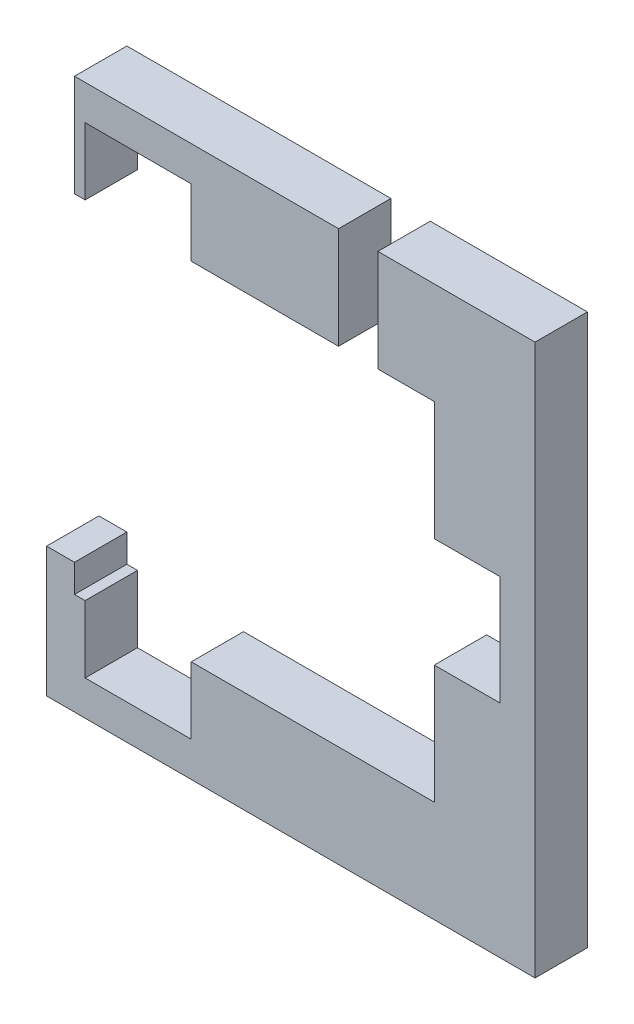
ISO-10303-21;
HEADER;
FILE_DESCRIPTION(('STEP AP214'),'2;1');
FILE_NAME('part.step','',(''),(''),'','','');
FILE_SCHEMA(('AUTOMOTIVE_DESIGN { 1 0 10303 214 1 1 1 1 }'));
ENDSEC;
DATA;
#1=APPLICATION_CONTEXT('core data for automotive mechanical design processes');
#2=APPLICATION_PROTOCOL_DEFINITION('international standard','automotive_design',2000,#1);
#3=PRODUCT_CONTEXT('',#1,'mechanical');
#4=PRODUCT('Part','Part','',(#3));
#5=PRODUCT_RELATED_PRODUCT_CATEGORY('part','',(#4));
#6=PRODUCT_DEFINITION_FORMATION('','',#4);
#7=PRODUCT_DEFINITION_CONTEXT('part definition',#1,'design');
#8=PRODUCT_DEFINITION('design','',#6,#7);
#9=PRODUCT_DEFINITION_SHAPE('','',#8);
#10=(LENGTH_UNIT() NAMED_UNIT(*) SI_UNIT(.MILLI.,.METRE.));
#11=(NAMED_UNIT(*) PLANE_ANGLE_UNIT() SI_UNIT($,.RADIAN.));
#12=(NAMED_UNIT(*) SI_UNIT($,.STERADIAN.) SOLID_ANGLE_UNIT());
#13=UNCERTAINTY_MEASURE_WITH_UNIT(LENGTH_MEASURE(1.E-05),#10,'distance_accuracy_value','');
#14=(GEOMETRIC_REPRESENTATION_CONTEXT(3) GLOBAL_UNCERTAINTY_ASSIGNED_CONTEXT((#13)) GLOBAL_UNIT_ASSIGNED_CONTEXT((#10,
#11,#12)) REPRESENTATION_CONTEXT('',''));
#15=CARTESIAN_POINT('',(0.,0.,0.));
#16=DIRECTION('',(0.,0.,1.));
#17=DIRECTION('',(1.,0.,0.));
#18=AXIS2_PLACEMENT_3D('',#15,#16,#17);
#19=CARTESIAN_POINT('',(7544.80021660651,3379.61343651415,4.7625));
#20=DIRECTION('',(0.,1.,0.));
#21=DIRECTION('',(0.,0.,1.));
#22=AXIS2_PLACEMENT_3D('',#19,#20,#21);
#23=PLANE('',#22);
#24=DIRECTION('',(1.,0.,0.));
#25=VECTOR('',#24,1.);
#26=CARTESIAN_POINT('',(7544.80021660651,3379.61343651415,0.));
#27=LINE('',#26,#25);
#28=CARTESIAN_POINT('',(7544.80021660651,3379.61343651415,0.));
#29=VERTEX_POINT('',#28);
#30=CARTESIAN_POINT('',(7589.25021660651,3379.61343651415,0.));
#31=VERTEX_POINT('',#30);
#32=EDGE_CURVE('E199',#29,#31,#27,.T.);
#33=ORIENTED_EDGE('',*,*,#32,.T.);
#34=DIRECTION('',(0.,0.,-1.));
#35=VECTOR('',#34,1.);
#36=CARTESIAN_POINT('',(7589.25021660651,3379.61343651415,4.7625));
#37=LINE('',#36,#35);
#38=CARTESIAN_POINT('',(7589.25021660651,3379.61343651415,4.7625));
#39=VERTEX_POINT('',#38);
#40=EDGE_CURVE('E12',#39,#31,#37,.T.);
#41=ORIENTED_EDGE('',*,*,#40,.F.);
#42=DIRECTION('',(1.,0.,0.));
#43=VECTOR('',#42,1.);
#44=CARTESIAN_POINT('',(7544.80021660651,3379.61343651415,4.7625));
#45=LINE('',#44,#43);
#46=CARTESIAN_POINT('',(7544.80021660651,3379.61343651415,4.7625));
#47=VERTEX_POINT('',#46);
#48=EDGE_CURVE('E233',#47,#39,#45,.T.);
#49=ORIENTED_EDGE('',*,*,#48,.F.);
#50=DIRECTION('',(0.,0.,-1.));
#51=VECTOR('',#50,1.);
#52=CARTESIAN_POINT('',(7544.80021660651,3379.61343651415,4.7625));
#53=LINE('',#52,#51);
#54=EDGE_CURVE('E195',#47,#29,#53,.T.);
#55=ORIENTED_EDGE('',*,*,#54,.T.);
#56=EDGE_LOOP('',(#33,#41,#49,#55));
#57=FACE_BOUND('',#56,.T.);
#58=ADVANCED_FACE('F43',(#57),#23,.F.);
#59=CARTESIAN_POINT('',(7589.25021660651,3429.72763651415,4.7625));
#60=DIRECTION('',(-1.,0.,0.));
#61=DIRECTION('',(0.,0.,1.));
#62=AXIS2_PLACEMENT_3D('',#59,#60,#61);
#63=PLANE('',#62);
#64=DIRECTION('',(0.,1.,0.));
#65=VECTOR('',#64,1.);
#66=CARTESIAN_POINT('',(7589.25021660651,3429.72763651415,0.));
#67=LINE('',#66,#65);
#68=CARTESIAN_POINT('',(7589.25021660651,3429.72763651415,0.));
#69=VERTEX_POINT('',#68);
#70=EDGE_CURVE('E202',#31,#69,#67,.T.);
#71=ORIENTED_EDGE('',*,*,#70,.T.);
#72=DIRECTION('',(0.,0.,-1.));
#73=VECTOR('',#72,1.);
#74=CARTESIAN_POINT('',(7589.25021660651,3429.72763651415,4.7625));
#75=LINE('',#74,#73);
#76=CARTESIAN_POINT('',(7589.25021660651,3429.72763651415,4.7625));
#77=VERTEX_POINT('',#76);
#78=EDGE_CURVE('E51',#77,#69,#75,.T.);
#79=ORIENTED_EDGE('',*,*,#78,.F.);
#80=DIRECTION('',(0.,1.,0.));
#81=VECTOR('',#80,1.);
#82=CARTESIAN_POINT('',(7589.25021660651,3429.72763651415,4.7625));
#83=LINE('',#82,#81);
#84=EDGE_CURVE('E132',#39,#77,#83,.T.);
#85=ORIENTED_EDGE('',*,*,#84,.F.);
#86=ORIENTED_EDGE('',*,*,#40,.T.);
#87=EDGE_LOOP('',(#71,#79,#85,#86));
#88=FACE_BOUND('',#87,.T.);
#89=ADVANCED_FACE('F341',(#88),#63,.F.);
#90=CARTESIAN_POINT('',(7574.95001660651,3429.72763651415,4.7625));
#91=DIRECTION('',(0.,-1.,0.));
#92=DIRECTION('',(1.,0.,0.));
#93=AXIS2_PLACEMENT_3D('',#90,#91,#92);
#94=PLANE('',#93);
#95=DIRECTION('',(-1.,0.,0.));
#96=VECTOR('',#95,1.);
#97=CARTESIAN_POINT('',(7574.95001660651,3429.72763651415,0.));
#98=LINE('',#97,#96);
#99=CARTESIAN_POINT('',(7574.95001660651,3429.72763651415,0.));
#100=VERTEX_POINT('',#99);
#101=EDGE_CURVE('E204',#69,#100,#98,.T.);
#102=ORIENTED_EDGE('',*,*,#101,.T.);
#103=DIRECTION('',(0.,0.,-1.));
#104=VECTOR('',#103,1.);
#105=CARTESIAN_POINT('',(7574.95001660651,3429.72763651415,4.7625));
#106=LINE('',#105,#104);
#107=CARTESIAN_POINT('',(7574.95001660651,3429.72763651415,4.7625));
#108=VERTEX_POINT('',#107);
#109=EDGE_CURVE('E270',#108,#100,#106,.T.);
#110=ORIENTED_EDGE('',*,*,#109,.F.);
#111=DIRECTION('',(-1.,0.,0.));
#112=VECTOR('',#111,1.);
#113=CARTESIAN_POINT('',(7574.95001660651,3429.72763651415,4.7625));
#114=LINE('',#113,#112);
#115=EDGE_CURVE('E278',#77,#108,#114,.T.);
#116=ORIENTED_EDGE('',*,*,#115,.F.);
#117=ORIENTED_EDGE('',*,*,#78,.T.);
#118=EDGE_LOOP('',(#102,#110,#116,#117));
#119=FACE_BOUND('',#118,.T.);
#120=ADVANCED_FACE('F276',(#119),#94,.F.);
#121=CARTESIAN_POINT('',(7574.95001660651,3429.72763651415,4.7625));
#122=DIRECTION('',(1.,-1.91603585309036E-13,0.));
#123=DIRECTION('',(1.91603585309036E-13,1.,0.));
#124=AXIS2_PLACEMENT_3D('',#121,#122,#123);
#125=PLANE('',#124);
#126=DIRECTION('',(-1.91603585309036E-13,-1.,0.));
#127=VECTOR('',#126,1.);
#128=CARTESIAN_POINT('',(7574.95001660651,3429.72763651415,0.));
#129=LINE('',#128,#127);
#130=CARTESIAN_POINT('',(7574.95001660651,3420.45663651415,0.));
#131=VERTEX_POINT('',#130);
#132=EDGE_CURVE('E206',#100,#131,#129,.T.);
#133=ORIENTED_EDGE('',*,*,#132,.T.);
#134=DIRECTION('',(0.,0.,-1.));
#135=VECTOR('',#134,1.);
#136=CARTESIAN_POINT('',(7574.95001660651,3420.45663651415,4.7625));
#137=LINE('',#136,#135);
#138=CARTESIAN_POINT('',(7574.95001660651,3420.45663651415,4.7625));
#139=VERTEX_POINT('',#138);
#140=EDGE_CURVE('E267',#139,#131,#137,.T.);
#141=ORIENTED_EDGE('',*,*,#140,.F.);
#142=DIRECTION('',(-1.91603585309036E-13,-1.,0.));
#143=VECTOR('',#142,1.);
#144=CARTESIAN_POINT('',(7574.95001660651,3429.72763651415,4.7625));
#145=LINE('',#144,#143);
#146=EDGE_CURVE('E296',#108,#139,#145,.T.);
#147=ORIENTED_EDGE('',*,*,#146,.F.);
#148=ORIENTED_EDGE('',*,*,#109,.T.);
#149=EDGE_LOOP('',(#133,#141,#147,#148));
#150=FACE_BOUND('',#149,.T.);
#151=ADVANCED_FACE('F287',(#150),#125,.F.);
#152=CARTESIAN_POINT('',(7574.95001660651,3420.45663651415,4.7625));
#153=DIRECTION('',(0.,1.,0.));
#154=DIRECTION('',(0.,0.,1.));
#155=AXIS2_PLACEMENT_3D('',#152,#153,#154);
#156=PLANE('',#155);
#157=DIRECTION('',(1.,0.,0.));
#158=VECTOR('',#157,1.);
#159=CARTESIAN_POINT('',(7574.95001660651,3420.45663651415,0.));
#160=LINE('',#159,#158);
#161=CARTESIAN_POINT('',(7580.08081660651,3420.45663651415,0.));
#162=VERTEX_POINT('',#161);
#163=EDGE_CURVE('E208',#131,#162,#160,.T.);
#164=ORIENTED_EDGE('',*,*,#163,.T.);
#165=DIRECTION('',(0.,0.,-1.));
#166=VECTOR('',#165,1.);
#167=CARTESIAN_POINT('',(7580.08081660651,3420.45663651415,4.7625));
#168=LINE('',#167,#166);
#169=CARTESIAN_POINT('',(7580.08081660651,3420.45663651415,4.7625));
#170=VERTEX_POINT('',#169);
#171=EDGE_CURVE('E264',#170,#162,#168,.T.);
#172=ORIENTED_EDGE('',*,*,#171,.F.);
#173=DIRECTION('',(1.,0.,0.));
#174=VECTOR('',#173,1.);
#175=CARTESIAN_POINT('',(7574.95001660651,3420.45663651415,4.7625));
#176=LINE('',#175,#174);
#177=EDGE_CURVE('E293',#139,#170,#176,.T.);
#178=ORIENTED_EDGE('',*,*,#177,.F.);
#179=ORIENTED_EDGE('',*,*,#140,.T.);
#180=EDGE_LOOP('',(#164,#172,#178,#179));
#181=FACE_BOUND('',#180,.T.);
#182=ADVANCED_FACE('F291',(#181),#156,.F.);
#183=CARTESIAN_POINT('',(7580.08081660651,3420.45663651415,4.7625));
#184=DIRECTION('',(1.,0.,0.));
#185=DIRECTION('',(0.,0.,-1.));
#186=AXIS2_PLACEMENT_3D('',#183,#184,#185);
#187=PLANE('',#186);
#188=DIRECTION('',(0.,-1.,0.));
#189=VECTOR('',#188,1.);
#190=CARTESIAN_POINT('',(7580.08081660651,3420.45663651415,0.));
#191=LINE('',#190,#189);
#192=CARTESIAN_POINT('',(7580.08081660651,3409.64893651415,0.));
#193=VERTEX_POINT('',#192);
#194=EDGE_CURVE('E210',#162,#193,#191,.T.);
#195=ORIENTED_EDGE('',*,*,#194,.T.);
#196=DIRECTION('',(0.,0.,-1.));
#197=VECTOR('',#196,1.);
#198=CARTESIAN_POINT('',(7580.08081660651,3409.64893651415,4.7625));
#199=LINE('',#198,#197);
#200=CARTESIAN_POINT('',(7580.08081660651,3409.64893651415,4.7625));
#201=VERTEX_POINT('',#200);
#202=EDGE_CURVE('E261',#201,#193,#199,.T.);
#203=ORIENTED_EDGE('',*,*,#202,.F.);
#204=DIRECTION('',(0.,-1.,0.));
#205=VECTOR('',#204,1.);
#206=CARTESIAN_POINT('',(7580.08081660651,3420.45663651415,4.7625));
#207=LINE('',#206,#205);
#208=EDGE_CURVE('E295',#170,#201,#207,.T.);
#209=ORIENTED_EDGE('',*,*,#208,.F.);
#210=ORIENTED_EDGE('',*,*,#171,.T.);
#211=EDGE_LOOP('',(#195,#203,#209,#210));
#212=FACE_BOUND('',#211,.T.);
#213=ADVANCED_FACE('F354',(#212),#187,.F.);
#214=CARTESIAN_POINT('',(7580.08081660651,3409.64893651415,4.7625));
#215=DIRECTION('',(0.,1.,0.));
#216=DIRECTION('',(0.,0.,1.));
#217=AXIS2_PLACEMENT_3D('',#214,#215,#216);
#218=PLANE('',#217);
#219=DIRECTION('',(1.,0.,0.));
#220=VECTOR('',#219,1.);
#221=CARTESIAN_POINT('',(7580.08081660651,3409.64893651415,0.));
#222=LINE('',#221,#220);
#223=CARTESIAN_POINT('',(7586.07521660651,3409.64893651415,0.));
#224=VERTEX_POINT('',#223);
#225=EDGE_CURVE('E212',#193,#224,#222,.T.);
#226=ORIENTED_EDGE('',*,*,#225,.T.);
#227=DIRECTION('',(0.,0.,-1.));
#228=VECTOR('',#227,1.);
#229=CARTESIAN_POINT('',(7586.07521660651,3409.64893651415,4.7625));
#230=LINE('',#229,#228);
#231=CARTESIAN_POINT('',(7586.07521660651,3409.64893651415,4.7625));
#232=VERTEX_POINT('',#231);
#233=EDGE_CURVE('E258',#232,#224,#230,.T.);
#234=ORIENTED_EDGE('',*,*,#233,.F.);
#235=DIRECTION('',(1.,0.,0.));
#236=VECTOR('',#235,1.);
#237=CARTESIAN_POINT('',(7580.08081660651,3409.64893651415,4.7625));
#238=LINE('',#237,#236);
#239=EDGE_CURVE('E298',#201,#232,#238,.T.);
#240=ORIENTED_EDGE('',*,*,#239,.F.);
#241=ORIENTED_EDGE('',*,*,#202,.T.);
#242=EDGE_LOOP('',(#226,#234,#240,#241));
#243=FACE_BOUND('',#242,.T.);
#244=ADVANCED_FACE('F357',(#243),#218,.F.);
#245=CARTESIAN_POINT('',(7586.07521660651,3409.64893651415,4.7625));
#246=DIRECTION('',(1.,0.,0.));
#247=DIRECTION('',(0.,0.,-1.));
#248=AXIS2_PLACEMENT_3D('',#245,#246,#247);
#249=PLANE('',#248);
#250=DIRECTION('',(0.,-1.,0.));
#251=VECTOR('',#250,1.);
#252=CARTESIAN_POINT('',(7586.07521660651,3409.64893651415,0.));
#253=LINE('',#252,#251);
#254=CARTESIAN_POINT('',(7586.07521660651,3399.69213651415,0.));
#255=VERTEX_POINT('',#254);
#256=EDGE_CURVE('E214',#224,#255,#253,.T.);
#257=ORIENTED_EDGE('',*,*,#256,.T.);
#258=DIRECTION('',(0.,0.,-1.));
#259=VECTOR('',#258,1.);
#260=CARTESIAN_POINT('',(7586.07521660651,3399.69213651415,4.7625));
#261=LINE('',#260,#259);
#262=CARTESIAN_POINT('',(7586.07521660651,3399.69213651415,4.7625));
#263=VERTEX_POINT('',#262);
#264=EDGE_CURVE('E255',#263,#255,#261,.T.);
#265=ORIENTED_EDGE('',*,*,#264,.F.);
#266=DIRECTION('',(0.,-1.,0.));
#267=VECTOR('',#266,1.);
#268=CARTESIAN_POINT('',(7586.07521660651,3409.64893651415,4.7625));
#269=LINE('',#268,#267);
#270=EDGE_CURVE('E304',#232,#263,#269,.T.);
#271=ORIENTED_EDGE('',*,*,#270,.F.);
#272=ORIENTED_EDGE('',*,*,#233,.T.);
#273=EDGE_LOOP('',(#257,#265,#271,#272));
#274=FACE_BOUND('',#273,.T.);
#275=ADVANCED_FACE('F361',(#274),#249,.F.);
#276=CARTESIAN_POINT('',(7580.08081660651,3399.69213651415,4.7625));
#277=DIRECTION('',(0.,-1.,0.));
#278=DIRECTION('',(0.,0.,-1.));
#279=AXIS2_PLACEMENT_3D('',#276,#277,#278);
#280=PLANE('',#279);
#281=DIRECTION('',(-1.,0.,0.));
#282=VECTOR('',#281,1.);
#283=CARTESIAN_POINT('',(7580.08081660651,3399.69213651415,0.));
#284=LINE('',#283,#282);
#285=CARTESIAN_POINT('',(7580.08081660651,3399.69213651415,0.));
#286=VERTEX_POINT('',#285);
#287=EDGE_CURVE('E216',#255,#286,#284,.T.);
#288=ORIENTED_EDGE('',*,*,#287,.T.);
#289=DIRECTION('',(0.,0.,-1.));
#290=VECTOR('',#289,1.);
#291=CARTESIAN_POINT('',(7580.08081660651,3399.69213651415,4.7625));
#292=LINE('',#291,#290);
#293=CARTESIAN_POINT('',(7580.08081660651,3399.69213651415,4.7625));
#294=VERTEX_POINT('',#293);
#295=EDGE_CURVE('E252',#294,#286,#292,.T.);
#296=ORIENTED_EDGE('',*,*,#295,.F.);
#297=DIRECTION('',(-1.,0.,0.));
#298=VECTOR('',#297,1.);
#299=CARTESIAN_POINT('',(7580.08081660651,3399.69213651415,4.7625));
#300=LINE('',#299,#298);
#301=EDGE_CURVE('E306',#263,#294,#300,.T.);
#302=ORIENTED_EDGE('',*,*,#301,.F.);
#303=ORIENTED_EDGE('',*,*,#264,.T.);
#304=EDGE_LOOP('',(#288,#296,#302,#303));
#305=FACE_BOUND('',#304,.T.);
#306=ADVANCED_FACE('F365',(#305),#280,.F.);
#307=CARTESIAN_POINT('',(7580.08081660651,3399.69213651415,4.7625));
#308=DIRECTION('',(1.,0.,0.));
#309=DIRECTION('',(0.,0.,-1.));
#310=AXIS2_PLACEMENT_3D('',#307,#308,#309);
#311=PLANE('',#310);
#312=DIRECTION('',(0.,-1.,0.));
#313=VECTOR('',#312,1.);
#314=CARTESIAN_POINT('',(7580.08081660651,3399.69213651415,0.));
#315=LINE('',#314,#313);
#316=CARTESIAN_POINT('',(7580.08081660651,3388.88443651415,0.));
#317=VERTEX_POINT('',#316);
#318=EDGE_CURVE('E218',#286,#317,#315,.T.);
#319=ORIENTED_EDGE('',*,*,#318,.T.);
#320=DIRECTION('',(0.,0.,-1.));
#321=VECTOR('',#320,1.);
#322=CARTESIAN_POINT('',(7580.08081660651,3388.88443651415,4.7625));
#323=LINE('',#322,#321);
#324=CARTESIAN_POINT('',(7580.08081660651,3388.88443651415,4.7625));
#325=VERTEX_POINT('',#324);
#326=EDGE_CURVE('E249',#325,#317,#323,.T.);
#327=ORIENTED_EDGE('',*,*,#326,.F.);
#328=DIRECTION('',(0.,-1.,0.));
#329=VECTOR('',#328,1.);
#330=CARTESIAN_POINT('',(7580.08081660651,3399.69213651415,4.7625));
#331=LINE('',#330,#329);
#332=EDGE_CURVE('E308',#294,#325,#331,.T.);
#333=ORIENTED_EDGE('',*,*,#332,.F.);
#334=ORIENTED_EDGE('',*,*,#295,.T.);
#335=EDGE_LOOP('',(#319,#327,#333,#334));
#336=FACE_BOUND('',#335,.T.);
#337=ADVANCED_FACE('F369',(#336),#311,.F.);
#338=CARTESIAN_POINT('',(7580.08081660651,3388.88443651415,4.7625));
#339=DIRECTION('',(0.,-1.,0.));
#340=DIRECTION('',(0.,0.,-1.));
#341=AXIS2_PLACEMENT_3D('',#338,#339,#340);
#342=PLANE('',#341);
#343=DIRECTION('',(-1.,0.,0.));
#344=VECTOR('',#343,1.);
#345=CARTESIAN_POINT('',(7580.08081660651,3388.88443651415,0.));
#346=LINE('',#345,#344);
#347=CARTESIAN_POINT('',(7557.95741660651,3388.88443651415,0.));
#348=VERTEX_POINT('',#347);
#349=EDGE_CURVE('E220',#317,#348,#346,.T.);
#350=ORIENTED_EDGE('',*,*,#349,.T.);
#351=DIRECTION('',(0.,0.,-1.));
#352=VECTOR('',#351,1.);
#353=CARTESIAN_POINT('',(7557.95741660651,3388.88443651415,4.7625));
#354=LINE('',#353,#352);
#355=CARTESIAN_POINT('',(7557.95741660651,3388.88443651415,4.7625));
#356=VERTEX_POINT('',#355);
#357=EDGE_CURVE('E246',#356,#348,#354,.T.);
#358=ORIENTED_EDGE('',*,*,#357,.F.);
#359=DIRECTION('',(-1.,0.,0.));
#360=VECTOR('',#359,1.);
#361=CARTESIAN_POINT('',(7580.08081660651,3388.88443651415,4.7625));
#362=LINE('',#361,#360);
#363=EDGE_CURVE('E310',#325,#356,#362,.T.);
#364=ORIENTED_EDGE('',*,*,#363,.F.);
#365=ORIENTED_EDGE('',*,*,#326,.T.);
#366=EDGE_LOOP('',(#350,#358,#364,#365));
#367=FACE_BOUND('',#366,.T.);
#368=ADVANCED_FACE('F373',(#367),#342,.F.);
#369=CARTESIAN_POINT('',(7557.95741660651,3388.88443651415,4.7625));
#370=DIRECTION('',(1.,2.91397119324194E-13,0.));
#371=DIRECTION('',(-2.91397119324194E-13,1.,0.));
#372=AXIS2_PLACEMENT_3D('',#369,#370,#371);
#373=PLANE('',#372);
#374=DIRECTION('',(2.91397119324194E-13,-1.,0.));
#375=VECTOR('',#374,1.);
#376=CARTESIAN_POINT('',(7557.95741660651,3388.88443651415,0.));
#377=LINE('',#376,#375);
#378=CARTESIAN_POINT('',(7557.95741660651,3382.78843651415,0.));
#379=VERTEX_POINT('',#378);
#380=EDGE_CURVE('E222',#348,#379,#377,.T.);
#381=ORIENTED_EDGE('',*,*,#380,.T.);
#382=DIRECTION('',(0.,0.,-1.));
#383=VECTOR('',#382,1.);
#384=CARTESIAN_POINT('',(7557.95741660651,3382.78843651415,4.7625));
#385=LINE('',#384,#383);
#386=CARTESIAN_POINT('',(7557.95741660651,3382.78843651415,4.7625));
#387=VERTEX_POINT('',#386);
#388=EDGE_CURVE('E243',#387,#379,#385,.T.);
#389=ORIENTED_EDGE('',*,*,#388,.F.);
#390=DIRECTION('',(2.91397119324194E-13,-1.,0.));
#391=VECTOR('',#390,1.);
#392=CARTESIAN_POINT('',(7557.95741660651,3388.88443651415,4.7625));
#393=LINE('',#392,#391);
#394=EDGE_CURVE('E312',#356,#387,#393,.T.);
#395=ORIENTED_EDGE('',*,*,#394,.F.);
#396=ORIENTED_EDGE('',*,*,#357,.T.);
#397=EDGE_LOOP('',(#381,#389,#395,#396));
#398=FACE_BOUND('',#397,.T.);
#399=ADVANCED_FACE('F377',(#398),#373,.F.);
#400=CARTESIAN_POINT('',(7548.30541660651,3382.78843651415,4.7625));
#401=DIRECTION('',(0.,-1.,0.));
#402=DIRECTION('',(0.,0.,-1.));
#403=AXIS2_PLACEMENT_3D('',#400,#401,#402);
#404=PLANE('',#403);
#405=DIRECTION('',(-1.,0.,0.));
#406=VECTOR('',#405,1.);
#407=CARTESIAN_POINT('',(7548.30541660651,3382.78843651415,0.));
#408=LINE('',#407,#406);
#409=CARTESIAN_POINT('',(7548.30541660651,3382.78843651415,0.));
#410=VERTEX_POINT('',#409);
#411=EDGE_CURVE('E224',#379,#410,#408,.T.);
#412=ORIENTED_EDGE('',*,*,#411,.T.);
#413=DIRECTION('',(0.,0.,-1.));
#414=VECTOR('',#413,1.);
#415=CARTESIAN_POINT('',(7548.30541660651,3382.78843651415,4.7625));
#416=LINE('',#415,#414);
#417=CARTESIAN_POINT('',(7548.30541660651,3382.78843651415,4.7625));
#418=VERTEX_POINT('',#417);
#419=EDGE_CURVE('E240',#418,#410,#416,.T.);
#420=ORIENTED_EDGE('',*,*,#419,.F.);
#421=DIRECTION('',(-1.,0.,0.));
#422=VECTOR('',#421,1.);
#423=CARTESIAN_POINT('',(7548.30541660651,3382.78843651415,4.7625));
#424=LINE('',#423,#422);
#425=EDGE_CURVE('E314',#387,#418,#424,.T.);
#426=ORIENTED_EDGE('',*,*,#425,.F.);
#427=ORIENTED_EDGE('',*,*,#388,.T.);
#428=EDGE_LOOP('',(#412,#420,#426,#427));
#429=FACE_BOUND('',#428,.T.);
#430=ADVANCED_FACE('F381',(#429),#404,.F.);
#431=CARTESIAN_POINT('',(7548.30541660651,3388.88443651415,4.7625));
#432=DIRECTION('',(-1.,0.,0.));
#433=DIRECTION('',(0.,0.,1.));
#434=AXIS2_PLACEMENT_3D('',#431,#432,#433);
#435=PLANE('',#434);
#436=DIRECTION('',(0.,1.,0.));
#437=VECTOR('',#436,1.);
#438=CARTESIAN_POINT('',(7548.30541660651,3388.88443651415,0.));
#439=LINE('',#438,#437);
#440=CARTESIAN_POINT('',(7548.30541660651,3388.88443651415,0.));
#441=VERTEX_POINT('',#440);
#442=EDGE_CURVE('E226',#410,#441,#439,.T.);
#443=ORIENTED_EDGE('',*,*,#442,.T.);
#444=DIRECTION('',(0.,0.,-1.));
#445=VECTOR('',#444,1.);
#446=CARTESIAN_POINT('',(7548.30541660651,3388.88443651415,4.7625));
#447=LINE('',#446,#445);
#448=CARTESIAN_POINT('',(7548.30541660651,3388.88443651415,4.7625));
#449=VERTEX_POINT('',#448);
#450=EDGE_CURVE('E237',#449,#441,#447,.T.);
#451=ORIENTED_EDGE('',*,*,#450,.F.);
#452=DIRECTION('',(0.,1.,0.));
#453=VECTOR('',#452,1.);
#454=CARTESIAN_POINT('',(7548.30541660651,3388.88443651415,4.7625));
#455=LINE('',#454,#453);
#456=EDGE_CURVE('E316',#418,#449,#455,.T.);
#457=ORIENTED_EDGE('',*,*,#456,.F.);
#458=ORIENTED_EDGE('',*,*,#419,.T.);
#459=EDGE_LOOP('',(#443,#451,#457,#458));
#460=FACE_BOUND('',#459,.T.);
#461=ADVANCED_FACE('F322',(#460),#435,.F.);
#462=CARTESIAN_POINT('',(7548.30541660651,3388.88443651415,4.7625));
#463=DIRECTION('',(0.,-1.,0.));
#464=DIRECTION('',(0.,0.,-1.));
#465=AXIS2_PLACEMENT_3D('',#462,#463,#464);
#466=PLANE('',#465);
#467=DIRECTION('',(-1.,0.,0.));
#468=VECTOR('',#467,1.);
#469=CARTESIAN_POINT('',(7548.30541660651,3388.88443651415,0.));
#470=LINE('',#469,#468);
#471=CARTESIAN_POINT('',(7547.34021660651,3388.88443651415,0.));
#472=VERTEX_POINT('',#471);
#473=EDGE_CURVE('E228',#441,#472,#470,.T.);
#474=ORIENTED_EDGE('',*,*,#473,.T.);
#475=DIRECTION('',(0.,0.,-1.));
#476=VECTOR('',#475,1.);
#477=CARTESIAN_POINT('',(7547.34021660651,3388.88443651415,4.7625));
#478=LINE('',#477,#476);
#479=CARTESIAN_POINT('',(7547.34021660651,3388.88443651415,4.7625));
#480=VERTEX_POINT('',#479);
#481=EDGE_CURVE('E190',#480,#472,#478,.T.);
#482=ORIENTED_EDGE('',*,*,#481,.F.);
#483=DIRECTION('',(-1.,0.,0.));
#484=VECTOR('',#483,1.);
#485=CARTESIAN_POINT('',(7548.30541660651,3388.88443651415,4.7625));
#486=LINE('',#485,#484);
#487=EDGE_CURVE('E181',#449,#480,#486,.T.);
#488=ORIENTED_EDGE('',*,*,#487,.F.);
#489=ORIENTED_EDGE('',*,*,#450,.T.);
#490=EDGE_LOOP('',(#474,#482,#488,#489));
#491=FACE_BOUND('',#490,.T.);
#492=ADVANCED_FACE('F326',(#491),#466,.F.);
#493=CARTESIAN_POINT('',(7547.34021660651,3391.42443651415,4.7625));
#494=DIRECTION('',(-1.,0.,0.));
#495=DIRECTION('',(0.,0.,1.));
#496=AXIS2_PLACEMENT_3D('',#493,#494,#495);
#497=PLANE('',#496);
#498=DIRECTION('',(0.,1.,0.));
#499=VECTOR('',#498,1.);
#500=CARTESIAN_POINT('',(7547.34021660651,3391.42443651415,0.));
#501=LINE('',#500,#499);
#502=CARTESIAN_POINT('',(7547.34021660651,3391.42443651415,0.));
#503=VERTEX_POINT('',#502);
#504=EDGE_CURVE('E189',#472,#503,#501,.T.);
#505=ORIENTED_EDGE('',*,*,#504,.T.);
#506=DIRECTION('',(0.,0.,-1.));
#507=VECTOR('',#506,1.);
#508=CARTESIAN_POINT('',(7547.34021660651,3391.42443651415,4.7625));
#509=LINE('',#508,#507);
#510=CARTESIAN_POINT('',(7547.34021660651,3391.42443651415,4.7625));
#511=VERTEX_POINT('',#510);
#512=EDGE_CURVE('E186',#511,#503,#509,.T.);
#513=ORIENTED_EDGE('',*,*,#512,.F.);
#514=DIRECTION('',(0.,1.,0.));
#515=VECTOR('',#514,1.);
#516=CARTESIAN_POINT('',(7547.34021660651,3391.42443651415,4.7625));
#517=LINE('',#516,#515);
#518=EDGE_CURVE('E175',#480,#511,#517,.T.);
#519=ORIENTED_EDGE('',*,*,#518,.F.);
#520=ORIENTED_EDGE('',*,*,#481,.T.);
#521=EDGE_LOOP('',(#505,#513,#519,#520));
#522=FACE_BOUND('',#521,.T.);
#523=ADVANCED_FACE('F187',(#522),#497,.F.);
#524=CARTESIAN_POINT('',(7547.34021660651,3391.42443651415,4.7625));
#525=DIRECTION('',(0.,-1.,0.));
#526=DIRECTION('',(0.,0.,-1.));
#527=AXIS2_PLACEMENT_3D('',#524,#525,#526);
#528=PLANE('',#527);
#529=DIRECTION('',(-1.,0.,0.));
#530=VECTOR('',#529,1.);
#531=CARTESIAN_POINT('',(7547.34021660651,3391.42443651415,0.));
#532=LINE('',#531,#530);
#533=CARTESIAN_POINT('',(7544.80021660651,3391.42443651415,0.));
#534=VERTEX_POINT('',#533);
#535=EDGE_CURVE('E118',#503,#534,#532,.T.);
#536=ORIENTED_EDGE('',*,*,#535,.T.);
#537=DIRECTION('',(0.,0.,-1.));
#538=VECTOR('',#537,1.);
#539=CARTESIAN_POINT('',(7544.80021660651,3391.42443651415,4.7625));
#540=LINE('',#539,#538);
#541=CARTESIAN_POINT('',(7544.80021660651,3391.42443651415,4.7625));
#542=VERTEX_POINT('',#541);
#543=EDGE_CURVE('E191',#542,#534,#540,.T.);
#544=ORIENTED_EDGE('',*,*,#543,.F.);
#545=DIRECTION('',(-1.,0.,0.));
#546=VECTOR('',#545,1.);
#547=CARTESIAN_POINT('',(7547.34021660651,3391.42443651415,4.7625));
#548=LINE('',#547,#546);
#549=EDGE_CURVE('E179',#511,#542,#548,.T.);
#550=ORIENTED_EDGE('',*,*,#549,.F.);
#551=ORIENTED_EDGE('',*,*,#512,.T.);
#552=EDGE_LOOP('',(#536,#544,#550,#551));
#553=FACE_BOUND('',#552,.T.);
#554=ADVANCED_FACE('F193',(#553),#528,.F.);
#555=CARTESIAN_POINT('',(7544.80021660651,3379.61343651415,4.7625));
#556=DIRECTION('',(1.,0.,0.));
#557=DIRECTION('',(0.,0.,-1.));
#558=AXIS2_PLACEMENT_3D('',#555,#556,#557);
#559=PLANE('',#558);
#560=DIRECTION('',(0.,-1.,0.));
#561=VECTOR('',#560,1.);
#562=CARTESIAN_POINT('',(7544.80021660651,3379.61343651415,0.));
#563=LINE('',#562,#561);
#564=EDGE_CURVE('E124',#534,#29,#563,.T.);
#565=ORIENTED_EDGE('',*,*,#564,.T.);
#566=ORIENTED_EDGE('',*,*,#54,.F.);
#567=DIRECTION('',(0.,-1.,0.));
#568=VECTOR('',#567,1.);
#569=CARTESIAN_POINT('',(7544.80021660651,3379.61343651415,4.7625));
#570=LINE('',#569,#568);
#571=EDGE_CURVE('E59',#542,#47,#570,.T.);
#572=ORIENTED_EDGE('',*,*,#571,.F.);
#573=ORIENTED_EDGE('',*,*,#543,.T.);
#574=EDGE_LOOP('',(#565,#566,#572,#573));
#575=FACE_BOUND('',#574,.T.);
#576=ADVANCED_FACE('F330',(#575),#559,.F.);
#577=CARTESIAN_POINT('',(0.,0.,4.7625));
#578=DIRECTION('',(0.,0.,-1.));
#579=DIRECTION('',(-1.,0.,0.));
#580=AXIS2_PLACEMENT_3D('',#577,#578,#579);
#581=PLANE('',#580);
#582=ORIENTED_EDGE('',*,*,#48,.T.);
#583=ORIENTED_EDGE('',*,*,#84,.T.);
#584=ORIENTED_EDGE('',*,*,#115,.T.);
#585=ORIENTED_EDGE('',*,*,#146,.T.);
#586=ORIENTED_EDGE('',*,*,#177,.T.);
#587=ORIENTED_EDGE('',*,*,#208,.T.);
#588=ORIENTED_EDGE('',*,*,#239,.T.);
#589=ORIENTED_EDGE('',*,*,#270,.T.);
#590=ORIENTED_EDGE('',*,*,#301,.T.);
#591=ORIENTED_EDGE('',*,*,#332,.T.);
#592=ORIENTED_EDGE('',*,*,#363,.T.);
#593=ORIENTED_EDGE('',*,*,#394,.T.);
#594=ORIENTED_EDGE('',*,*,#425,.T.);
#595=ORIENTED_EDGE('',*,*,#456,.T.);
#596=ORIENTED_EDGE('',*,*,#487,.T.);
#597=ORIENTED_EDGE('',*,*,#518,.T.);
#598=ORIENTED_EDGE('',*,*,#549,.T.);
#599=ORIENTED_EDGE('',*,*,#571,.T.);
#600=EDGE_LOOP('',(#582,#583,#584,#585,#586,#587,#588,#589,#590,#591,#592,#593,#594,#595,#596,
#597,#598,#599));
#601=FACE_BOUND('',#600,.T.);
#602=ADVANCED_FACE('F177',(#601),#581,.F.);
#603=CARTESIAN_POINT('',(0.,0.,0.));
#604=DIRECTION('',(0.,0.,-1.));
#605=DIRECTION('',(-1.,0.,0.));
#606=AXIS2_PLACEMENT_3D('',#603,#604,#605);
#607=PLANE('',#606);
#608=ORIENTED_EDGE('',*,*,#32,.F.);
#609=ORIENTED_EDGE('',*,*,#564,.F.);
#610=ORIENTED_EDGE('',*,*,#535,.F.);
#611=ORIENTED_EDGE('',*,*,#504,.F.);
#612=ORIENTED_EDGE('',*,*,#473,.F.);
#613=ORIENTED_EDGE('',*,*,#442,.F.);
#614=ORIENTED_EDGE('',*,*,#411,.F.);
#615=ORIENTED_EDGE('',*,*,#380,.F.);
#616=ORIENTED_EDGE('',*,*,#349,.F.);
#617=ORIENTED_EDGE('',*,*,#318,.F.);
#618=ORIENTED_EDGE('',*,*,#287,.F.);
#619=ORIENTED_EDGE('',*,*,#256,.F.);
#620=ORIENTED_EDGE('',*,*,#225,.F.);
#621=ORIENTED_EDGE('',*,*,#194,.F.);
#622=ORIENTED_EDGE('',*,*,#163,.F.);
#623=ORIENTED_EDGE('',*,*,#132,.F.);
#624=ORIENTED_EDGE('',*,*,#101,.F.);
#625=ORIENTED_EDGE('',*,*,#70,.F.);
#626=EDGE_LOOP('',(#608,#609,#610,#611,#612,#613,#614,#615,#616,#617,#618,#619,#620,#621,#622,
#623,#624,#625));
#627=FACE_BOUND('',#626,.T.);
#628=ADVANCED_FACE('F282',(#627),#607,.T.);
#629=CLOSED_SHELL('',(#58,#89,#120,#151,#182,#213,#244,#275,#306,#337,#368,#399,#430,#461,#492,
#523,#554,#576,#602,#628));
#630=MANIFOLD_SOLID_BREP('B2',#629);
#631=CARTESIAN_POINT('',(7547.34021660651,3420.45663651415,4.7625));
#632=DIRECTION('',(0.,1.,0.));
#633=DIRECTION('',(0.,0.,1.));
#634=AXIS2_PLACEMENT_3D('',#631,#632,#633);
#635=PLANE('',#634);
#636=DIRECTION('',(1.,0.,0.));
#637=VECTOR('',#636,1.);
#638=CARTESIAN_POINT('',(7547.34021660651,3420.45663651415,0.));
#639=LINE('',#638,#637);
#640=CARTESIAN_POINT('',(7547.34021660651,3420.45663651415,0.));
#641=VERTEX_POINT('',#640);
#642=CARTESIAN_POINT('',(7548.30541660651,3420.45663651415,0.));
#643=VERTEX_POINT('',#642);
#644=EDGE_CURVE('E627',#641,#643,#639,.T.);
#645=ORIENTED_EDGE('',*,*,#644,.T.);
#646=DIRECTION('',(0.,0.,-1.));
#647=VECTOR('',#646,1.);
#648=CARTESIAN_POINT('',(7548.30541660651,3420.45663651415,4.7625));
#649=LINE('',#648,#647);
#650=CARTESIAN_POINT('',(7548.30541660651,3420.45663651415,4.7625));
#651=VERTEX_POINT('',#650);
#652=EDGE_CURVE('E41',#651,#643,#649,.T.);
#653=ORIENTED_EDGE('',*,*,#652,.F.);
#654=DIRECTION('',(1.,0.,0.));
#655=VECTOR('',#654,1.);
#656=CARTESIAN_POINT('',(7547.34021660651,3420.45663651415,4.7625));
#657=LINE('',#656,#655);
#658=CARTESIAN_POINT('',(7547.34021660651,3420.45663651415,4.7625));
#659=VERTEX_POINT('',#658);
#660=EDGE_CURVE('E641',#659,#651,#657,.T.);
#661=ORIENTED_EDGE('',*,*,#660,.F.);
#662=DIRECTION('',(0.,0.,-1.));
#663=VECTOR('',#662,1.);
#664=CARTESIAN_POINT('',(7547.34021660651,3420.45663651415,4.7625));
#665=LINE('',#664,#663);
#666=EDGE_CURVE('E623',#659,#641,#665,.T.);
#667=ORIENTED_EDGE('',*,*,#666,.T.);
#668=EDGE_LOOP('',(#645,#653,#661,#667));
#669=FACE_BOUND('',#668,.T.);
#670=ADVANCED_FACE('F531',(#669),#635,.F.);
#671=CARTESIAN_POINT('',(7548.30541660651,3420.45663651415,4.7625));
#672=DIRECTION('',(-1.,0.,0.));
#673=DIRECTION('',(0.,0.,1.));
#674=AXIS2_PLACEMENT_3D('',#671,#672,#673);
#675=PLANE('',#674);
#676=DIRECTION('',(0.,1.,0.));
#677=VECTOR('',#676,1.);
#678=CARTESIAN_POINT('',(7548.30541660651,3420.45663651415,0.));
#679=LINE('',#678,#677);
#680=CARTESIAN_POINT('',(7548.30541660651,3426.55263651415,0.));
#681=VERTEX_POINT('',#680);
#682=EDGE_CURVE('E630',#643,#681,#679,.T.);
#683=ORIENTED_EDGE('',*,*,#682,.T.);
#684=DIRECTION('',(0.,0.,-1.));
#685=VECTOR('',#684,1.);
#686=CARTESIAN_POINT('',(7548.30541660651,3426.55263651415,4.7625));
#687=LINE('',#686,#685);
#688=CARTESIAN_POINT('',(7548.30541660651,3426.55263651415,4.7625));
#689=VERTEX_POINT('',#688);
#690=EDGE_CURVE('E539',#689,#681,#687,.T.);
#691=ORIENTED_EDGE('',*,*,#690,.F.);
#692=DIRECTION('',(0.,1.,0.));
#693=VECTOR('',#692,1.);
#694=CARTESIAN_POINT('',(7548.30541660651,3420.45663651415,4.7625));
#695=LINE('',#694,#693);
#696=EDGE_CURVE('E590',#651,#689,#695,.T.);
#697=ORIENTED_EDGE('',*,*,#696,.F.);
#698=ORIENTED_EDGE('',*,*,#652,.T.);
#699=EDGE_LOOP('',(#683,#691,#697,#698));
#700=FACE_BOUND('',#699,.T.);
#701=ADVANCED_FACE('F676',(#700),#675,.F.);
#702=CARTESIAN_POINT('',(7548.30541660651,3426.55263651415,4.7625));
#703=DIRECTION('',(0.,1.,0.));
#704=DIRECTION('',(0.,0.,1.));
#705=AXIS2_PLACEMENT_3D('',#702,#703,#704);
#706=PLANE('',#705);
#707=DIRECTION('',(1.,0.,0.));
#708=VECTOR('',#707,1.);
#709=CARTESIAN_POINT('',(7548.30541660651,3426.55263651415,0.));
#710=LINE('',#709,#708);
#711=CARTESIAN_POINT('',(7557.95741660651,3426.55263651415,0.));
#712=VERTEX_POINT('',#711);
#713=EDGE_CURVE('E632',#681,#712,#710,.T.);
#714=ORIENTED_EDGE('',*,*,#713,.T.);
#715=DIRECTION('',(0.,0.,-1.));
#716=VECTOR('',#715,1.);
#717=CARTESIAN_POINT('',(7557.95741660651,3426.55263651415,4.7625));
#718=LINE('',#717,#716);
#719=CARTESIAN_POINT('',(7557.95741660651,3426.55263651415,4.7625));
#720=VERTEX_POINT('',#719);
#721=EDGE_CURVE('E648',#720,#712,#718,.T.);
#722=ORIENTED_EDGE('',*,*,#721,.F.);
#723=DIRECTION('',(1.,0.,0.));
#724=VECTOR('',#723,1.);
#725=CARTESIAN_POINT('',(7548.30541660651,3426.55263651415,4.7625));
#726=LINE('',#725,#724);
#727=EDGE_CURVE('E656',#689,#720,#726,.T.);
#728=ORIENTED_EDGE('',*,*,#727,.F.);
#729=ORIENTED_EDGE('',*,*,#690,.T.);
#730=EDGE_LOOP('',(#714,#722,#728,#729));
#731=FACE_BOUND('',#730,.T.);
#732=ADVANCED_FACE('F654',(#731),#706,.F.);
#733=CARTESIAN_POINT('',(7557.95741660651,3420.45663651415,4.7625));
#734=DIRECTION('',(1.,0.,0.));
#735=DIRECTION('',(0.,0.,-1.));
#736=AXIS2_PLACEMENT_3D('',#733,#734,#735);
#737=PLANE('',#736);
#738=DIRECTION('',(0.,-1.,0.));
#739=VECTOR('',#738,1.);
#740=CARTESIAN_POINT('',(7557.95741660651,3420.45663651415,0.));
#741=LINE('',#740,#739);
#742=CARTESIAN_POINT('',(7557.95741660651,3420.45663651415,0.));
#743=VERTEX_POINT('',#742);
#744=EDGE_CURVE('E634',#712,#743,#741,.T.);
#745=ORIENTED_EDGE('',*,*,#744,.T.);
#746=DIRECTION('',(0.,0.,-1.));
#747=VECTOR('',#746,1.);
#748=CARTESIAN_POINT('',(7557.95741660651,3420.45663651415,4.7625));
#749=LINE('',#748,#747);
#750=CARTESIAN_POINT('',(7557.95741660651,3420.45663651415,4.7625));
#751=VERTEX_POINT('',#750);
#752=EDGE_CURVE('E645',#751,#743,#749,.T.);
#753=ORIENTED_EDGE('',*,*,#752,.F.);
#754=DIRECTION('',(0.,-1.,0.));
#755=VECTOR('',#754,1.);
#756=CARTESIAN_POINT('',(7557.95741660651,3420.45663651415,4.7625));
#757=LINE('',#756,#755);
#758=EDGE_CURVE('E668',#720,#751,#757,.T.);
#759=ORIENTED_EDGE('',*,*,#758,.F.);
#760=ORIENTED_EDGE('',*,*,#721,.T.);
#761=EDGE_LOOP('',(#745,#753,#759,#760));
#762=FACE_BOUND('',#761,.T.);
#763=ADVANCED_FACE('F664',(#762),#737,.F.);
#764=CARTESIAN_POINT('',(7557.95741660651,3420.45663651415,4.7625));
#765=DIRECTION('',(0.,1.,0.));
#766=DIRECTION('',(0.,0.,1.));
#767=AXIS2_PLACEMENT_3D('',#764,#765,#766);
#768=PLANE('',#767);
#769=DIRECTION('',(1.,0.,0.));
#770=VECTOR('',#769,1.);
#771=CARTESIAN_POINT('',(7557.95741660651,3420.45663651415,0.));
#772=LINE('',#771,#770);
#773=CARTESIAN_POINT('',(7571.36861660651,3420.45663651415,0.));
#774=VERTEX_POINT('',#773);
#775=EDGE_CURVE('E636',#743,#774,#772,.T.);
#776=ORIENTED_EDGE('',*,*,#775,.T.);
#777=DIRECTION('',(0.,0.,-1.));
#778=VECTOR('',#777,1.);
#779=CARTESIAN_POINT('',(7571.36861660651,3420.45663651415,4.7625));
#780=LINE('',#779,#778);
#781=CARTESIAN_POINT('',(7571.36861660651,3420.45663651415,4.7625));
#782=VERTEX_POINT('',#781);
#783=EDGE_CURVE('E618',#782,#774,#780,.T.);
#784=ORIENTED_EDGE('',*,*,#783,.F.);
#785=DIRECTION('',(1.,0.,0.));
#786=VECTOR('',#785,1.);
#787=CARTESIAN_POINT('',(7557.95741660651,3420.45663651415,4.7625));
#788=LINE('',#787,#786);
#789=EDGE_CURVE('E609',#751,#782,#788,.T.);
#790=ORIENTED_EDGE('',*,*,#789,.F.);
#791=ORIENTED_EDGE('',*,*,#752,.T.);
#792=EDGE_LOOP('',(#776,#784,#790,#791));
#793=FACE_BOUND('',#792,.T.);
#794=ADVANCED_FACE('F667',(#793),#768,.F.);
#795=CARTESIAN_POINT('',(7571.36861660651,3429.72763651415,4.7625));
#796=DIRECTION('',(-1.,1.91603585309036E-13,0.));
#797=DIRECTION('',(-1.91603585309036E-13,-1.,0.));
#798=AXIS2_PLACEMENT_3D('',#795,#796,#797);
#799=PLANE('',#798);
#800=DIRECTION('',(1.91603585309036E-13,1.,0.));
#801=VECTOR('',#800,1.);
#802=CARTESIAN_POINT('',(7571.36861660651,3429.72763651415,0.));
#803=LINE('',#802,#801);
#804=CARTESIAN_POINT('',(7571.36861660651,3429.72763651415,0.));
#805=VERTEX_POINT('',#804);
#806=EDGE_CURVE('E617',#774,#805,#803,.T.);
#807=ORIENTED_EDGE('',*,*,#806,.T.);
#808=DIRECTION('',(0.,0.,-1.));
#809=VECTOR('',#808,1.);
#810=CARTESIAN_POINT('',(7571.36861660651,3429.72763651415,4.7625));
#811=LINE('',#810,#809);
#812=CARTESIAN_POINT('',(7571.36861660651,3429.72763651415,4.7625));
#813=VERTEX_POINT('',#812);
#814=EDGE_CURVE('E614',#813,#805,#811,.T.);
#815=ORIENTED_EDGE('',*,*,#814,.F.);
#816=DIRECTION('',(1.91603585309036E-13,1.,0.));
#817=VECTOR('',#816,1.);
#818=CARTESIAN_POINT('',(7571.36861660651,3429.72763651415,4.7625));
#819=LINE('',#818,#817);
#820=EDGE_CURVE('E603',#782,#813,#819,.T.);
#821=ORIENTED_EDGE('',*,*,#820,.F.);
#822=ORIENTED_EDGE('',*,*,#783,.T.);
#823=EDGE_LOOP('',(#807,#815,#821,#822));
#824=FACE_BOUND('',#823,.T.);
#825=ADVANCED_FACE('F615',(#824),#799,.F.);
#826=CARTESIAN_POINT('',(7547.34021660651,3429.72763651415,4.7625));
#827=DIRECTION('',(0.,-1.,0.));
#828=DIRECTION('',(1.,0.,0.));
#829=AXIS2_PLACEMENT_3D('',#826,#827,#828);
#830=PLANE('',#829);
#831=DIRECTION('',(-1.,0.,0.));
#832=VECTOR('',#831,1.);
#833=CARTESIAN_POINT('',(7547.34021660651,3429.72763651415,0.));
#834=LINE('',#833,#832);
#835=CARTESIAN_POINT('',(7547.34021660651,3429.72763651415,0.));
#836=VERTEX_POINT('',#835);
#837=EDGE_CURVE('E576',#805,#836,#834,.T.);
#838=ORIENTED_EDGE('',*,*,#837,.T.);
#839=DIRECTION('',(0.,0.,-1.));
#840=VECTOR('',#839,1.);
#841=CARTESIAN_POINT('',(7547.34021660651,3429.72763651415,4.7625));
#842=LINE('',#841,#840);
#843=CARTESIAN_POINT('',(7547.34021660651,3429.72763651415,4.7625));
#844=VERTEX_POINT('',#843);
#845=EDGE_CURVE('E619',#844,#836,#842,.T.);
#846=ORIENTED_EDGE('',*,*,#845,.F.);
#847=DIRECTION('',(-1.,0.,0.));
#848=VECTOR('',#847,1.);
#849=CARTESIAN_POINT('',(7547.34021660651,3429.72763651415,4.7625));
#850=LINE('',#849,#848);
#851=EDGE_CURVE('E607',#813,#844,#850,.T.);
#852=ORIENTED_EDGE('',*,*,#851,.F.);
#853=ORIENTED_EDGE('',*,*,#814,.T.);
#854=EDGE_LOOP('',(#838,#846,#852,#853));
#855=FACE_BOUND('',#854,.T.);
#856=ADVANCED_FACE('F621',(#855),#830,.F.);
#857=CARTESIAN_POINT('',(7547.34021660651,3420.45663651415,4.7625));
#858=DIRECTION('',(1.,0.,0.));
#859=DIRECTION('',(0.,0.,-1.));
#860=AXIS2_PLACEMENT_3D('',#857,#858,#859);
#861=PLANE('',#860);
#862=DIRECTION('',(0.,-1.,0.));
#863=VECTOR('',#862,1.);
#864=CARTESIAN_POINT('',(7547.34021660651,3420.45663651415,0.));
#865=LINE('',#864,#863);
#866=EDGE_CURVE('E582',#836,#641,#865,.T.);
#867=ORIENTED_EDGE('',*,*,#866,.T.);
#868=ORIENTED_EDGE('',*,*,#666,.F.);
#869=DIRECTION('',(0.,-1.,0.));
#870=VECTOR('',#869,1.);
#871=CARTESIAN_POINT('',(7547.34021660651,3420.45663651415,4.7625));
#872=LINE('',#871,#870);
#873=EDGE_CURVE('E547',#844,#659,#872,.T.);
#874=ORIENTED_EDGE('',*,*,#873,.F.);
#875=ORIENTED_EDGE('',*,*,#845,.T.);
#876=EDGE_LOOP('',(#867,#868,#874,#875));
#877=FACE_BOUND('',#876,.T.);
#878=ADVANCED_FACE('F692',(#877),#861,.F.);
#879=CARTESIAN_POINT('',(0.,0.,4.7625));
#880=DIRECTION('',(0.,0.,1.));
#881=DIRECTION('',(1.,0.,0.));
#882=AXIS2_PLACEMENT_3D('',#879,#880,#881);
#883=PLANE('',#882);
#884=ORIENTED_EDGE('',*,*,#660,.T.);
#885=ORIENTED_EDGE('',*,*,#696,.T.);
#886=ORIENTED_EDGE('',*,*,#727,.T.);
#887=ORIENTED_EDGE('',*,*,#758,.T.);
#888=ORIENTED_EDGE('',*,*,#789,.T.);
#889=ORIENTED_EDGE('',*,*,#820,.T.);
#890=ORIENTED_EDGE('',*,*,#851,.T.);
#891=ORIENTED_EDGE('',*,*,#873,.T.);
#892=EDGE_LOOP('',(#884,#885,#886,#887,#888,#889,#890,#891));
#893=FACE_BOUND('',#892,.T.);
#894=ADVANCED_FACE('F605',(#893),#883,.T.);
#895=CARTESIAN_POINT('',(0.,0.,0.));
#896=DIRECTION('',(0.,0.,1.));
#897=DIRECTION('',(1.,0.,0.));
#898=AXIS2_PLACEMENT_3D('',#895,#896,#897);
#899=PLANE('',#898);
#900=ORIENTED_EDGE('',*,*,#644,.F.);
#901=ORIENTED_EDGE('',*,*,#866,.F.);
#902=ORIENTED_EDGE('',*,*,#837,.F.);
#903=ORIENTED_EDGE('',*,*,#806,.F.);
#904=ORIENTED_EDGE('',*,*,#775,.F.);
#905=ORIENTED_EDGE('',*,*,#744,.F.);
#906=ORIENTED_EDGE('',*,*,#713,.F.);
#907=ORIENTED_EDGE('',*,*,#682,.F.);
#908=EDGE_LOOP('',(#900,#901,#902,#903,#904,#905,#906,#907));
#909=FACE_BOUND('',#908,.T.);
#910=ADVANCED_FACE('F660',(#909),#899,.F.);
#911=CLOSED_SHELL('',(#670,#701,#732,#763,#794,#825,#856,#878,#894,#910));
#912=MANIFOLD_SOLID_BREP('B6',#911);
#913=ADVANCED_BREP_SHAPE_REPRESENTATION('',(#18,#630,#912),#14);
#914=SHAPE_DEFINITION_REPRESENTATION(#9,#913);
ENDSEC;
END-ISO-10303-21;
